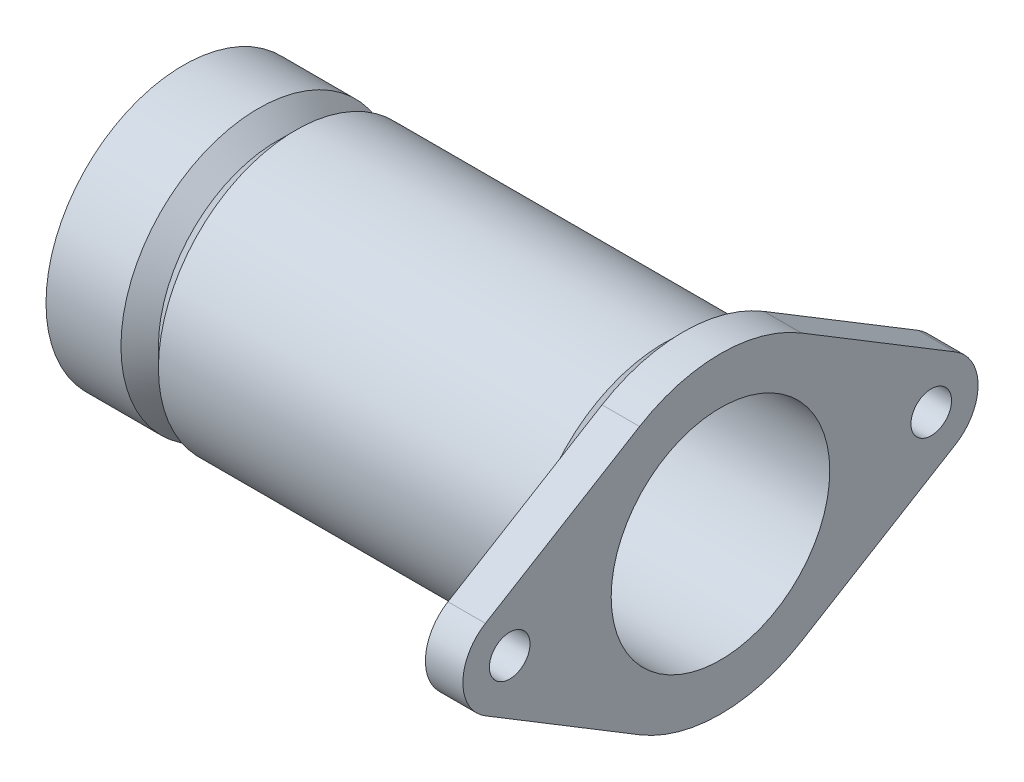
ISO-10303-21;
HEADER;
FILE_DESCRIPTION(('STEP AP214'),'2;1');
FILE_NAME('part.step','',(''),(''),'','','');
FILE_SCHEMA(('AUTOMOTIVE_DESIGN { 1 0 10303 214 1 1 1 1 }'));
ENDSEC;
DATA;
#1=APPLICATION_CONTEXT('core data for automotive mechanical design processes');
#2=APPLICATION_PROTOCOL_DEFINITION('international standard','automotive_design',2000,#1);
#3=PRODUCT_CONTEXT('',#1,'mechanical');
#4=PRODUCT('Part','Part','',(#3));
#5=PRODUCT_RELATED_PRODUCT_CATEGORY('part','',(#4));
#6=PRODUCT_DEFINITION_FORMATION('','',#4);
#7=PRODUCT_DEFINITION_CONTEXT('part definition',#1,'design');
#8=PRODUCT_DEFINITION('design','',#6,#7);
#9=PRODUCT_DEFINITION_SHAPE('','',#8);
#10=(LENGTH_UNIT() NAMED_UNIT(*) SI_UNIT(.MILLI.,.METRE.));
#11=(NAMED_UNIT(*) PLANE_ANGLE_UNIT() SI_UNIT($,.RADIAN.));
#12=(NAMED_UNIT(*) SI_UNIT($,.STERADIAN.) SOLID_ANGLE_UNIT());
#13=UNCERTAINTY_MEASURE_WITH_UNIT(LENGTH_MEASURE(1.E-05),#10,'distance_accuracy_value','');
#14=(GEOMETRIC_REPRESENTATION_CONTEXT(3) GLOBAL_UNCERTAINTY_ASSIGNED_CONTEXT((#13)) GLOBAL_UNIT_ASSIGNED_CONTEXT((#10,
#11,#12)) REPRESENTATION_CONTEXT('',''));
#15=CARTESIAN_POINT('',(0.,0.,0.));
#16=DIRECTION('',(0.,0.,1.));
#17=DIRECTION('',(1.,0.,0.));
#18=AXIS2_PLACEMENT_3D('',#15,#16,#17);
#19=CARTESIAN_POINT('',(160.,0.,0.));
#20=DIRECTION('',(-1.,0.,0.));
#21=DIRECTION('',(0.,0.,1.));
#22=AXIS2_PLACEMENT_3D('',#19,#20,#21);
#23=CYLINDRICAL_SURFACE('',#22,44.);
#24=CARTESIAN_POINT('',(0.,0.,0.));
#25=DIRECTION('',(1.,0.,0.));
#26=DIRECTION('',(0.,0.,-1.));
#27=AXIS2_PLACEMENT_3D('',#24,#25,#26);
#28=CIRCLE('',#27,44.);
#29=CARTESIAN_POINT('',(0.,0.,-44.));
#30=VERTEX_POINT('',#29);
#31=EDGE_CURVE('E11',#30,#30,#28,.T.);
#32=ORIENTED_EDGE('',*,*,#31,.T.);
#33=EDGE_LOOP('',(#32));
#34=FACE_BOUND('',#33,.T.);
#35=CARTESIAN_POINT('',(24.0020946431096,0.,0.));
#36=DIRECTION('',(-1.,0.,0.));
#37=DIRECTION('',(0.,0.,1.));
#38=AXIS2_PLACEMENT_3D('',#35,#36,#37);
#39=CIRCLE('',#38,44.);
#40=CARTESIAN_POINT('',(24.0020946431096,0.,44.));
#41=VERTEX_POINT('',#40);
#42=EDGE_CURVE('E196',#41,#41,#39,.F.);
#43=ORIENTED_EDGE('',*,*,#42,.F.);
#44=EDGE_LOOP('',(#43));
#45=FACE_BOUND('',#44,.T.);
#46=ADVANCED_FACE('F38',(#34,#45),#23,.T.);
#47=CARTESIAN_POINT('',(0.,0.,0.));
#48=DIRECTION('',(1.,0.,0.));
#49=DIRECTION('',(0.,0.,-1.));
#50=AXIS2_PLACEMENT_3D('',#47,#48,#49);
#51=PLANE('',#50);
#52=CARTESIAN_POINT('',(0.,0.,0.));
#53=DIRECTION('',(-1.,0.,0.));
#54=DIRECTION('',(0.,0.,1.));
#55=AXIS2_PLACEMENT_3D('',#52,#53,#54);
#56=CIRCLE('',#55,25.5);
#57=CARTESIAN_POINT('',(0.,0.,25.5));
#58=VERTEX_POINT('',#57);
#59=EDGE_CURVE('E192',#58,#58,#56,.T.);
#60=ORIENTED_EDGE('',*,*,#59,.F.);
#61=EDGE_LOOP('',(#60));
#62=FACE_BOUND('',#61,.T.);
#63=ORIENTED_EDGE('',*,*,#31,.F.);
#64=EDGE_LOOP('',(#63));
#65=FACE_BOUND('',#64,.T.);
#66=ADVANCED_FACE('F279',(#62,#65),#51,.F.);
#67=CARTESIAN_POINT('',(160.,0.,0.));
#68=DIRECTION('',(1.,0.,0.));
#69=DIRECTION('',(0.,0.,-1.));
#70=AXIS2_PLACEMENT_3D('',#67,#68,#69);
#71=PLANE('',#70);
#72=CARTESIAN_POINT('',(160.,0.,67.5));
#73=DIRECTION('',(1.,0.,0.));
#74=DIRECTION('',(0.,0.,-1.));
#75=AXIS2_PLACEMENT_3D('',#72,#73,#74);
#76=CIRCLE('',#75,6.5);
#77=CARTESIAN_POINT('',(160.,0.,61.));
#78=VERTEX_POINT('',#77);
#79=EDGE_CURVE('E226',#78,#78,#76,.T.);
#80=ORIENTED_EDGE('',*,*,#79,.T.);
#81=EDGE_LOOP('',(#80));
#82=FACE_BOUND('',#81,.T.);
#83=CARTESIAN_POINT('',(160.,0.,-67.5));
#84=DIRECTION('',(1.,0.,0.));
#85=DIRECTION('',(0.,0.,-1.));
#86=AXIS2_PLACEMENT_3D('',#83,#84,#85);
#87=CIRCLE('',#86,6.5);
#88=CARTESIAN_POINT('',(160.,0.,-74.));
#89=VERTEX_POINT('',#88);
#90=EDGE_CURVE('E148',#89,#89,#87,.T.);
#91=ORIENTED_EDGE('',*,*,#90,.T.);
#92=EDGE_LOOP('',(#91));
#93=FACE_BOUND('',#92,.T.);
#94=CARTESIAN_POINT('',(160.,0.,0.));
#95=DIRECTION('',(1.,0.,0.));
#96=DIRECTION('',(0.,0.,-1.));
#97=AXIS2_PLACEMENT_3D('',#94,#95,#96);
#98=CIRCLE('',#97,50.);
#99=CARTESIAN_POINT('',(160.,42.7533199282044,-25.9259259259259));
#100=VERTEX_POINT('',#99);
#101=CARTESIAN_POINT('',(160.,42.7533199282044,25.9259259259259));
#102=VERTEX_POINT('',#101);
#103=EDGE_CURVE('E143',#100,#102,#98,.T.);
#104=ORIENTED_EDGE('',*,*,#103,.F.);
#105=DIRECTION('',(0.,0.518518518518518,0.855066398564089));
#106=VECTOR('',#105,1.);
#107=CARTESIAN_POINT('',(160.,42.7533199282044,-25.9259259259259));
#108=LINE('',#107,#106);
#109=CARTESIAN_POINT('',(160.,12.8259959784613,-75.2777777777778));
#110=VERTEX_POINT('',#109);
#111=EDGE_CURVE('E93',#110,#100,#108,.T.);
#112=ORIENTED_EDGE('',*,*,#111,.F.);
#113=CARTESIAN_POINT('',(160.,0.,-67.5));
#114=DIRECTION('',(1.,0.,0.));
#115=DIRECTION('',(0.,0.,-1.));
#116=AXIS2_PLACEMENT_3D('',#113,#114,#115);
#117=CIRCLE('',#116,15.);
#118=CARTESIAN_POINT('',(160.,-12.8259959784613,-75.2777777777778));
#119=VERTEX_POINT('',#118);
#120=EDGE_CURVE('E87',#119,#110,#117,.T.);
#121=ORIENTED_EDGE('',*,*,#120,.F.);
#122=DIRECTION('',(0.,0.518518518518519,-0.855066398564089));
#123=VECTOR('',#122,1.);
#124=CARTESIAN_POINT('',(160.,-12.8259959784613,-75.2777777777778));
#125=LINE('',#124,#123);
#126=CARTESIAN_POINT('',(160.,-42.7533199282044,-25.9259259259259));
#127=VERTEX_POINT('',#126);
#128=EDGE_CURVE('E130',#127,#119,#125,.T.);
#129=ORIENTED_EDGE('',*,*,#128,.F.);
#130=CARTESIAN_POINT('',(160.,0.,0.));
#131=DIRECTION('',(1.,0.,0.));
#132=DIRECTION('',(0.,0.,-1.));
#133=AXIS2_PLACEMENT_3D('',#130,#131,#132);
#134=CIRCLE('',#133,50.);
#135=CARTESIAN_POINT('',(160.,-42.7533199282044,25.9259259259259));
#136=VERTEX_POINT('',#135);
#137=EDGE_CURVE('E157',#136,#127,#134,.T.);
#138=ORIENTED_EDGE('',*,*,#137,.F.);
#139=DIRECTION('',(0.,-0.518518518518518,-0.855066398564089));
#140=VECTOR('',#139,1.);
#141=CARTESIAN_POINT('',(160.,-12.8259959784613,75.2777777777778));
#142=LINE('',#141,#140);
#143=CARTESIAN_POINT('',(160.,-12.8259959784613,75.2777777777778));
#144=VERTEX_POINT('',#143);
#145=EDGE_CURVE('E154',#144,#136,#142,.T.);
#146=ORIENTED_EDGE('',*,*,#145,.F.);
#147=CARTESIAN_POINT('',(160.,0.,67.5));
#148=DIRECTION('',(1.,0.,0.));
#149=DIRECTION('',(0.,0.,-1.));
#150=AXIS2_PLACEMENT_3D('',#147,#148,#149);
#151=CIRCLE('',#150,15.);
#152=CARTESIAN_POINT('',(160.,12.8259959784613,75.2777777777778));
#153=VERTEX_POINT('',#152);
#154=EDGE_CURVE('E151',#153,#144,#151,.T.);
#155=ORIENTED_EDGE('',*,*,#154,.F.);
#156=DIRECTION('',(0.,-0.518518518518518,0.855066398564089));
#157=VECTOR('',#156,1.);
#158=CARTESIAN_POINT('',(160.,42.7533199282044,25.9259259259259));
#159=LINE('',#158,#157);
#160=EDGE_CURVE('E147',#102,#153,#159,.T.);
#161=ORIENTED_EDGE('',*,*,#160,.F.);
#162=EDGE_LOOP('',(#104,#112,#121,#129,#138,#146,#155,#161));
#163=FACE_BOUND('',#162,.T.);
#164=CARTESIAN_POINT('',(160.,0.,0.));
#165=DIRECTION('',(-1.,0.,0.));
#166=DIRECTION('',(0.,0.,1.));
#167=AXIS2_PLACEMENT_3D('',#164,#165,#166);
#168=CIRCLE('',#167,38.0006122518727);
#169=CARTESIAN_POINT('',(160.,0.,38.0006122518727));
#170=VERTEX_POINT('',#169);
#171=EDGE_CURVE('E213',#170,#170,#168,.T.);
#172=ORIENTED_EDGE('',*,*,#171,.F.);
#173=EDGE_LOOP('',(#172));
#174=FACE_BOUND('',#173,.T.);
#175=ADVANCED_FACE('F259',(#82,#93,#163,#174),#71,.F.);
#176=CARTESIAN_POINT('',(172.,0.,0.));
#177=DIRECTION('',(-1.,0.,0.));
#178=DIRECTION('',(0.,0.,1.));
#179=AXIS2_PLACEMENT_3D('',#176,#177,#178);
#180=CYLINDRICAL_SURFACE('',#179,50.);
#181=ORIENTED_EDGE('',*,*,#103,.T.);
#182=DIRECTION('',(-1.,0.,0.));
#183=VECTOR('',#182,1.);
#184=CARTESIAN_POINT('',(172.,42.7533199282044,25.9259259259259));
#185=LINE('',#184,#183);
#186=CARTESIAN_POINT('',(172.,42.7533199282044,25.9259259259259));
#187=VERTEX_POINT('',#186);
#188=EDGE_CURVE('E49',#187,#102,#185,.T.);
#189=ORIENTED_EDGE('',*,*,#188,.F.);
#190=CARTESIAN_POINT('',(172.,0.,0.));
#191=DIRECTION('',(1.,0.,0.));
#192=DIRECTION('',(0.,0.,-1.));
#193=AXIS2_PLACEMENT_3D('',#190,#191,#192);
#194=CIRCLE('',#193,50.);
#195=CARTESIAN_POINT('',(172.,42.7533199282044,-25.9259259259259));
#196=VERTEX_POINT('',#195);
#197=EDGE_CURVE('E166',#196,#187,#194,.T.);
#198=ORIENTED_EDGE('',*,*,#197,.F.);
#199=DIRECTION('',(-1.,0.,0.));
#200=VECTOR('',#199,1.);
#201=CARTESIAN_POINT('',(172.,42.7533199282044,-25.9259259259259));
#202=LINE('',#201,#200);
#203=EDGE_CURVE('E139',#196,#100,#202,.T.);
#204=ORIENTED_EDGE('',*,*,#203,.T.);
#205=EDGE_LOOP('',(#181,#189,#198,#204));
#206=FACE_BOUND('',#205,.T.);
#207=ADVANCED_FACE('F264',(#206),#180,.T.);
#208=CARTESIAN_POINT('',(172.,42.7533199282044,25.9259259259259));
#209=DIRECTION('',(0.,-0.855066398564089,-0.518518518518518));
#210=DIRECTION('',(0.,0.518518518518518,-0.855066398564089));
#211=AXIS2_PLACEMENT_3D('',#208,#209,#210);
#212=PLANE('',#211);
#213=ORIENTED_EDGE('',*,*,#160,.T.);
#214=DIRECTION('',(-1.,0.,0.));
#215=VECTOR('',#214,1.);
#216=CARTESIAN_POINT('',(172.,12.8259959784613,75.2777777777778));
#217=LINE('',#216,#215);
#218=CARTESIAN_POINT('',(172.,12.8259959784613,75.2777777777778));
#219=VERTEX_POINT('',#218);
#220=EDGE_CURVE('E181',#219,#153,#217,.T.);
#221=ORIENTED_EDGE('',*,*,#220,.F.);
#222=DIRECTION('',(0.,-0.518518518518518,0.855066398564089));
#223=VECTOR('',#222,1.);
#224=CARTESIAN_POINT('',(172.,42.7533199282044,25.9259259259259));
#225=LINE('',#224,#223);
#226=EDGE_CURVE('E102',#187,#219,#225,.T.);
#227=ORIENTED_EDGE('',*,*,#226,.F.);
#228=ORIENTED_EDGE('',*,*,#188,.T.);
#229=EDGE_LOOP('',(#213,#221,#227,#228));
#230=FACE_BOUND('',#229,.T.);
#231=ADVANCED_FACE('F334',(#230),#212,.F.);
#232=CARTESIAN_POINT('',(172.,0.,67.5));
#233=DIRECTION('',(-1.,0.,0.));
#234=DIRECTION('',(0.,0.,1.));
#235=AXIS2_PLACEMENT_3D('',#232,#233,#234);
#236=CYLINDRICAL_SURFACE('',#235,15.);
#237=ORIENTED_EDGE('',*,*,#154,.T.);
#238=DIRECTION('',(-1.,0.,0.));
#239=VECTOR('',#238,1.);
#240=CARTESIAN_POINT('',(172.,-12.8259959784613,75.2777777777778));
#241=LINE('',#240,#239);
#242=CARTESIAN_POINT('',(172.,-12.8259959784613,75.2777777777778));
#243=VERTEX_POINT('',#242);
#244=EDGE_CURVE('E177',#243,#144,#241,.T.);
#245=ORIENTED_EDGE('',*,*,#244,.F.);
#246=CARTESIAN_POINT('',(172.,0.,67.5));
#247=DIRECTION('',(1.,0.,0.));
#248=DIRECTION('',(0.,0.,-1.));
#249=AXIS2_PLACEMENT_3D('',#246,#247,#248);
#250=CIRCLE('',#249,15.);
#251=EDGE_CURVE('E241',#219,#243,#250,.T.);
#252=ORIENTED_EDGE('',*,*,#251,.F.);
#253=ORIENTED_EDGE('',*,*,#220,.T.);
#254=EDGE_LOOP('',(#237,#245,#252,#253));
#255=FACE_BOUND('',#254,.T.);
#256=ADVANCED_FACE('F344',(#255),#236,.T.);
#257=CARTESIAN_POINT('',(172.,-12.8259959784613,75.2777777777778));
#258=DIRECTION('',(0.,0.855066398564089,-0.518518518518518));
#259=DIRECTION('',(0.,0.518518518518518,0.855066398564089));
#260=AXIS2_PLACEMENT_3D('',#257,#258,#259);
#261=PLANE('',#260);
#262=ORIENTED_EDGE('',*,*,#145,.T.);
#263=DIRECTION('',(-1.,0.,0.));
#264=VECTOR('',#263,1.);
#265=CARTESIAN_POINT('',(172.,-42.7533199282044,25.9259259259259));
#266=LINE('',#265,#264);
#267=CARTESIAN_POINT('',(172.,-42.7533199282044,25.9259259259259));
#268=VERTEX_POINT('',#267);
#269=EDGE_CURVE('E173',#268,#136,#266,.T.);
#270=ORIENTED_EDGE('',*,*,#269,.F.);
#271=DIRECTION('',(0.,-0.518518518518518,-0.855066398564089));
#272=VECTOR('',#271,1.);
#273=CARTESIAN_POINT('',(172.,-12.8259959784613,75.2777777777778));
#274=LINE('',#273,#272);
#275=EDGE_CURVE('E244',#243,#268,#274,.T.);
#276=ORIENTED_EDGE('',*,*,#275,.F.);
#277=ORIENTED_EDGE('',*,*,#244,.T.);
#278=EDGE_LOOP('',(#262,#270,#276,#277));
#279=FACE_BOUND('',#278,.T.);
#280=ADVANCED_FACE('F252',(#279),#261,.F.);
#281=CARTESIAN_POINT('',(172.,0.,0.));
#282=DIRECTION('',(-1.,0.,0.));
#283=DIRECTION('',(0.,0.,1.));
#284=AXIS2_PLACEMENT_3D('',#281,#282,#283);
#285=CYLINDRICAL_SURFACE('',#284,50.);
#286=ORIENTED_EDGE('',*,*,#137,.T.);
#287=DIRECTION('',(-1.,0.,0.));
#288=VECTOR('',#287,1.);
#289=CARTESIAN_POINT('',(172.,-42.7533199282044,-25.9259259259259));
#290=LINE('',#289,#288);
#291=CARTESIAN_POINT('',(172.,-42.7533199282044,-25.9259259259259));
#292=VERTEX_POINT('',#291);
#293=EDGE_CURVE('E132',#292,#127,#290,.T.);
#294=ORIENTED_EDGE('',*,*,#293,.F.);
#295=CARTESIAN_POINT('',(172.,0.,0.));
#296=DIRECTION('',(1.,0.,0.));
#297=DIRECTION('',(0.,0.,-1.));
#298=AXIS2_PLACEMENT_3D('',#295,#296,#297);
#299=CIRCLE('',#298,50.);
#300=EDGE_CURVE('E121',#268,#292,#299,.T.);
#301=ORIENTED_EDGE('',*,*,#300,.F.);
#302=ORIENTED_EDGE('',*,*,#269,.T.);
#303=EDGE_LOOP('',(#286,#294,#301,#302));
#304=FACE_BOUND('',#303,.T.);
#305=ADVANCED_FACE('F256',(#304),#285,.T.);
#306=CARTESIAN_POINT('',(172.,-12.8259959784613,-75.2777777777778));
#307=DIRECTION('',(0.,0.855066398564089,0.518518518518518));
#308=DIRECTION('',(0.,-0.518518518518519,0.855066398564089));
#309=AXIS2_PLACEMENT_3D('',#306,#307,#308);
#310=PLANE('',#309);
#311=ORIENTED_EDGE('',*,*,#128,.T.);
#312=DIRECTION('',(-1.,0.,0.));
#313=VECTOR('',#312,1.);
#314=CARTESIAN_POINT('',(172.,-12.8259959784613,-75.2777777777778));
#315=LINE('',#314,#313);
#316=CARTESIAN_POINT('',(172.,-12.8259959784613,-75.2777777777778));
#317=VERTEX_POINT('',#316);
#318=EDGE_CURVE('E127',#317,#119,#315,.T.);
#319=ORIENTED_EDGE('',*,*,#318,.F.);
#320=DIRECTION('',(0.,0.518518518518519,-0.855066398564089));
#321=VECTOR('',#320,1.);
#322=CARTESIAN_POINT('',(172.,-12.8259959784613,-75.2777777777778));
#323=LINE('',#322,#321);
#324=EDGE_CURVE('E115',#292,#317,#323,.T.);
#325=ORIENTED_EDGE('',*,*,#324,.F.);
#326=ORIENTED_EDGE('',*,*,#293,.T.);
#327=EDGE_LOOP('',(#311,#319,#325,#326));
#328=FACE_BOUND('',#327,.T.);
#329=ADVANCED_FACE('F128',(#328),#310,.F.);
#330=CARTESIAN_POINT('',(172.,0.,-67.5));
#331=DIRECTION('',(-1.,0.,0.));
#332=DIRECTION('',(0.,0.,1.));
#333=AXIS2_PLACEMENT_3D('',#330,#331,#332);
#334=CYLINDRICAL_SURFACE('',#333,15.);
#335=ORIENTED_EDGE('',*,*,#120,.T.);
#336=DIRECTION('',(-1.,0.,0.));
#337=VECTOR('',#336,1.);
#338=CARTESIAN_POINT('',(172.,12.8259959784613,-75.2777777777778));
#339=LINE('',#338,#337);
#340=CARTESIAN_POINT('',(172.,12.8259959784613,-75.2777777777778));
#341=VERTEX_POINT('',#340);
#342=EDGE_CURVE('E133',#341,#110,#339,.T.);
#343=ORIENTED_EDGE('',*,*,#342,.F.);
#344=CARTESIAN_POINT('',(172.,0.,-67.5));
#345=DIRECTION('',(1.,0.,0.));
#346=DIRECTION('',(0.,0.,-1.));
#347=AXIS2_PLACEMENT_3D('',#344,#345,#346);
#348=CIRCLE('',#347,15.);
#349=EDGE_CURVE('E119',#317,#341,#348,.T.);
#350=ORIENTED_EDGE('',*,*,#349,.F.);
#351=ORIENTED_EDGE('',*,*,#318,.T.);
#352=EDGE_LOOP('',(#335,#343,#350,#351));
#353=FACE_BOUND('',#352,.T.);
#354=ADVANCED_FACE('F135',(#353),#334,.T.);
#355=CARTESIAN_POINT('',(172.,42.7533199282044,-25.9259259259259));
#356=DIRECTION('',(0.,-0.855066398564089,0.518518518518519));
#357=DIRECTION('',(0.,-0.518518518518519,-0.855066398564089));
#358=AXIS2_PLACEMENT_3D('',#355,#356,#357);
#359=PLANE('',#358);
#360=ORIENTED_EDGE('',*,*,#111,.T.);
#361=ORIENTED_EDGE('',*,*,#203,.F.);
#362=DIRECTION('',(0.,0.518518518518518,0.855066398564089));
#363=VECTOR('',#362,1.);
#364=CARTESIAN_POINT('',(172.,42.7533199282044,-25.9259259259259));
#365=LINE('',#364,#363);
#366=EDGE_CURVE('E58',#341,#196,#365,.T.);
#367=ORIENTED_EDGE('',*,*,#366,.F.);
#368=ORIENTED_EDGE('',*,*,#342,.T.);
#369=EDGE_LOOP('',(#360,#361,#367,#368));
#370=FACE_BOUND('',#369,.T.);
#371=ADVANCED_FACE('F266',(#370),#359,.F.);
#372=CARTESIAN_POINT('',(172.,0.,0.));
#373=DIRECTION('',(1.,0.,0.));
#374=DIRECTION('',(0.,0.,-1.));
#375=AXIS2_PLACEMENT_3D('',#372,#373,#374);
#376=PLANE('',#375);
#377=CARTESIAN_POINT('',(172.,0.,0.));
#378=DIRECTION('',(1.,0.,0.));
#379=DIRECTION('',(0.,0.,-1.));
#380=AXIS2_PLACEMENT_3D('',#377,#378,#379);
#381=CIRCLE('',#380,35.);
#382=CARTESIAN_POINT('',(172.,0.,-35.));
#383=VERTEX_POINT('',#382);
#384=EDGE_CURVE('E191',#383,#383,#381,.T.);
#385=ORIENTED_EDGE('',*,*,#384,.F.);
#386=EDGE_LOOP('',(#385));
#387=FACE_BOUND('',#386,.T.);
#388=CARTESIAN_POINT('',(172.,0.,67.5));
#389=DIRECTION('',(1.,0.,0.));
#390=DIRECTION('',(0.,0.,-1.));
#391=AXIS2_PLACEMENT_3D('',#388,#389,#390);
#392=CIRCLE('',#391,6.5);
#393=CARTESIAN_POINT('',(172.,0.,61.));
#394=VERTEX_POINT('',#393);
#395=EDGE_CURVE('E219',#394,#394,#392,.T.);
#396=ORIENTED_EDGE('',*,*,#395,.F.);
#397=EDGE_LOOP('',(#396));
#398=FACE_BOUND('',#397,.T.);
#399=CARTESIAN_POINT('',(172.,0.,-67.5));
#400=DIRECTION('',(1.,0.,0.));
#401=DIRECTION('',(0.,0.,-1.));
#402=AXIS2_PLACEMENT_3D('',#399,#400,#401);
#403=CIRCLE('',#402,6.5);
#404=CARTESIAN_POINT('',(172.,0.,-74.));
#405=VERTEX_POINT('',#404);
#406=EDGE_CURVE('E230',#405,#405,#403,.T.);
#407=ORIENTED_EDGE('',*,*,#406,.F.);
#408=EDGE_LOOP('',(#407));
#409=FACE_BOUND('',#408,.T.);
#410=ORIENTED_EDGE('',*,*,#197,.T.);
#411=ORIENTED_EDGE('',*,*,#226,.T.);
#412=ORIENTED_EDGE('',*,*,#251,.T.);
#413=ORIENTED_EDGE('',*,*,#275,.T.);
#414=ORIENTED_EDGE('',*,*,#300,.T.);
#415=ORIENTED_EDGE('',*,*,#324,.T.);
#416=ORIENTED_EDGE('',*,*,#349,.T.);
#417=ORIENTED_EDGE('',*,*,#366,.T.);
#418=EDGE_LOOP('',(#410,#411,#412,#413,#414,#415,#416,#417));
#419=FACE_BOUND('',#418,.T.);
#420=ADVANCED_FACE('F117',(#387,#398,#409,#419),#376,.T.);
#421=CARTESIAN_POINT('',(92.,0.,-67.5));
#422=DIRECTION('',(1.,0.,0.));
#423=DIRECTION('',(0.,0.,-1.));
#424=AXIS2_PLACEMENT_3D('',#421,#422,#423);
#425=CYLINDRICAL_SURFACE('',#424,6.5);
#426=ORIENTED_EDGE('',*,*,#406,.T.);
#427=EDGE_LOOP('',(#426));
#428=FACE_BOUND('',#427,.T.);
#429=ORIENTED_EDGE('',*,*,#90,.F.);
#430=EDGE_LOOP('',(#429));
#431=FACE_BOUND('',#430,.T.);
#432=ADVANCED_FACE('F273',(#428,#431),#425,.F.);
#433=CARTESIAN_POINT('',(92.,0.,67.5));
#434=DIRECTION('',(1.,0.,0.));
#435=DIRECTION('',(0.,0.,-1.));
#436=AXIS2_PLACEMENT_3D('',#433,#434,#435);
#437=CYLINDRICAL_SURFACE('',#436,6.5);
#438=ORIENTED_EDGE('',*,*,#395,.T.);
#439=EDGE_LOOP('',(#438));
#440=FACE_BOUND('',#439,.T.);
#441=ORIENTED_EDGE('',*,*,#79,.F.);
#442=EDGE_LOOP('',(#441));
#443=FACE_BOUND('',#442,.T.);
#444=ADVANCED_FACE('F324',(#440,#443),#437,.F.);
#445=CARTESIAN_POINT('',(30.,0.,0.));
#446=DIRECTION('',(1.,0.,0.));
#447=DIRECTION('',(0.,0.,-1.));
#448=AXIS2_PLACEMENT_3D('',#445,#446,#447);
#449=CYLINDRICAL_SURFACE('',#448,35.);
#450=CARTESIAN_POINT('',(30.,0.,0.));
#451=DIRECTION('',(1.,0.,0.));
#452=DIRECTION('',(0.,0.,-1.));
#453=AXIS2_PLACEMENT_3D('',#450,#451,#452);
#454=CIRCLE('',#453,35.);
#455=CARTESIAN_POINT('',(30.,0.,-35.));
#456=VERTEX_POINT('',#455);
#457=EDGE_CURVE('E215',#456,#456,#454,.T.);
#458=ORIENTED_EDGE('',*,*,#457,.F.);
#459=EDGE_LOOP('',(#458));
#460=FACE_BOUND('',#459,.T.);
#461=ORIENTED_EDGE('',*,*,#384,.T.);
#462=EDGE_LOOP('',(#461));
#463=FACE_BOUND('',#462,.T.);
#464=ADVANCED_FACE('F320',(#460,#463),#449,.F.);
#465=CARTESIAN_POINT('',(30.,0.,0.));
#466=DIRECTION('',(1.,0.,0.));
#467=DIRECTION('',(0.,0.,-1.));
#468=AXIS2_PLACEMENT_3D('',#465,#466,#467);
#469=PLANE('',#468);
#470=CARTESIAN_POINT('',(30.,0.,0.));
#471=DIRECTION('',(1.,0.,0.));
#472=DIRECTION('',(0.,0.,-1.));
#473=AXIS2_PLACEMENT_3D('',#470,#471,#472);
#474=CIRCLE('',#473,25.5);
#475=CARTESIAN_POINT('',(30.,0.,-25.5));
#476=VERTEX_POINT('',#475);
#477=EDGE_CURVE('E187',#476,#476,#474,.T.);
#478=ORIENTED_EDGE('',*,*,#477,.F.);
#479=EDGE_LOOP('',(#478));
#480=FACE_BOUND('',#479,.T.);
#481=ORIENTED_EDGE('',*,*,#457,.T.);
#482=EDGE_LOOP('',(#481));
#483=FACE_BOUND('',#482,.T.);
#484=ADVANCED_FACE('F313',(#480,#483),#469,.T.);
#485=CARTESIAN_POINT('',(82.,0.,0.));
#486=DIRECTION('',(-1.,0.,0.));
#487=DIRECTION('',(0.,0.,1.));
#488=AXIS2_PLACEMENT_3D('',#485,#486,#487);
#489=CYLINDRICAL_SURFACE('',#488,25.5);
#490=ORIENTED_EDGE('',*,*,#477,.T.);
#491=EDGE_LOOP('',(#490));
#492=FACE_BOUND('',#491,.T.);
#493=ORIENTED_EDGE('',*,*,#59,.T.);
#494=EDGE_LOOP('',(#493));
#495=FACE_BOUND('',#494,.T.);
#496=ADVANCED_FACE('F303',(#492,#495),#489,.F.);
#497=CARTESIAN_POINT('',(154.,0.,0.));
#498=DIRECTION('',(-1.,0.,0.));
#499=DIRECTION('',(0.,0.,1.));
#500=AXIS2_PLACEMENT_3D('',#497,#498,#499);
#501=CONICAL_SURFACE('',#500,44.0006122518727,0.785398163397453);
#502=ORIENTED_EDGE('',*,*,#171,.T.);
#503=EDGE_LOOP('',(#502));
#504=FACE_BOUND('',#503,.T.);
#505=CARTESIAN_POINT('',(154.000612251873,0.,0.));
#506=DIRECTION('',(-1.,0.,0.));
#507=DIRECTION('',(0.,0.,1.));
#508=AXIS2_PLACEMENT_3D('',#505,#506,#507);
#509=CIRCLE('',#508,44.);
#510=CARTESIAN_POINT('',(154.000612251873,0.,44.));
#511=VERTEX_POINT('',#510);
#512=EDGE_CURVE('E193',#511,#511,#509,.F.);
#513=ORIENTED_EDGE('',*,*,#512,.T.);
#514=EDGE_LOOP('',(#513));
#515=FACE_BOUND('',#514,.T.);
#516=ADVANCED_FACE('F301',(#504,#515),#501,.T.);
#517=CARTESIAN_POINT('',(30.,0.,0.));
#518=DIRECTION('',(1.,0.,0.));
#519=DIRECTION('',(0.,0.,-1.));
#520=AXIS2_PLACEMENT_3D('',#517,#518,#519);
#521=CONICAL_SURFACE('',#520,38.0020952153936,0.785398211104445);
#522=CARTESIAN_POINT('',(30.,0.,0.));
#523=DIRECTION('',(-1.,0.,0.));
#524=DIRECTION('',(0.,0.,1.));
#525=AXIS2_PLACEMENT_3D('',#522,#523,#524);
#526=CIRCLE('',#525,38.0020952153936);
#527=CARTESIAN_POINT('',(30.,0.,38.0020952153936));
#528=VERTEX_POINT('',#527);
#529=EDGE_CURVE('E197',#528,#528,#526,.T.);
#530=ORIENTED_EDGE('',*,*,#529,.F.);
#531=EDGE_LOOP('',(#530));
#532=FACE_BOUND('',#531,.T.);
#533=CARTESIAN_POINT('',(35.9979042123224,0.,0.));
#534=DIRECTION('',(1.,0.,0.));
#535=DIRECTION('',(0.,0.,-1.));
#536=AXIS2_PLACEMENT_3D('',#533,#534,#535);
#537=CIRCLE('',#536,44.);
#538=CARTESIAN_POINT('',(35.9979042123224,0.,-44.));
#539=VERTEX_POINT('',#538);
#540=EDGE_CURVE('E42',#539,#539,#537,.F.);
#541=ORIENTED_EDGE('',*,*,#540,.T.);
#542=EDGE_LOOP('',(#541));
#543=FACE_BOUND('',#542,.T.);
#544=ADVANCED_FACE('F295',(#532,#543),#521,.T.);
#545=CARTESIAN_POINT('',(23.9999994275161,0.,0.));
#546=DIRECTION('',(-1.,0.,0.));
#547=DIRECTION('',(0.,0.,1.));
#548=AXIS2_PLACEMENT_3D('',#545,#546,#547);
#549=CONICAL_SURFACE('',#548,44.0020952153936,0.785398115690457);
#550=ORIENTED_EDGE('',*,*,#529,.T.);
#551=EDGE_LOOP('',(#550));
#552=FACE_BOUND('',#551,.T.);
#553=ORIENTED_EDGE('',*,*,#42,.T.);
#554=EDGE_LOOP('',(#553));
#555=FACE_BOUND('',#554,.T.);
#556=ADVANCED_FACE('F289',(#552,#555),#549,.T.);
#557=ORIENTED_EDGE('',*,*,#512,.F.);
#558=EDGE_LOOP('',(#557));
#559=FACE_BOUND('',#558,.T.);
#560=ORIENTED_EDGE('',*,*,#540,.F.);
#561=EDGE_LOOP('',(#560));
#562=FACE_BOUND('',#561,.T.);
#563=ADVANCED_FACE('F40',(#559,#562),#23,.T.);
#564=CLOSED_SHELL('',(#46,#66,#175,#207,#231,#256,#280,#305,#329,#354,#371,#420,#432,#444,#464,
#484,#496,#516,#544,#556,#563));
#565=MANIFOLD_SOLID_BREP('B2',#564);
#566=ADVANCED_BREP_SHAPE_REPRESENTATION('',(#18,#565),#14);
#567=SHAPE_DEFINITION_REPRESENTATION(#9,#566);
ENDSEC;
END-ISO-10303-21;
